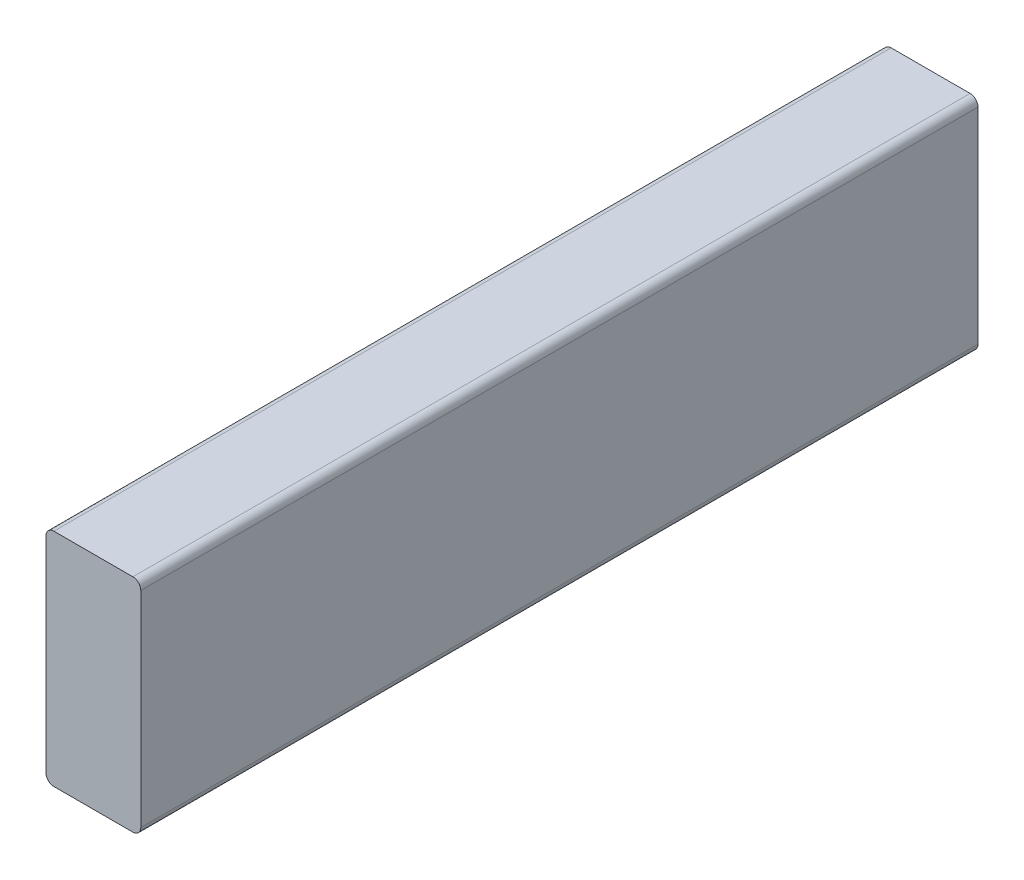
ISO-10303-21;
HEADER;
FILE_DESCRIPTION(('STEP AP214'),'2;1');
FILE_NAME('part.step','',(''),(''),'','','');
FILE_SCHEMA(('AUTOMOTIVE_DESIGN { 1 0 10303 214 1 1 1 1 }'));
ENDSEC;
DATA;
#1=APPLICATION_CONTEXT('core data for automotive mechanical design processes');
#2=APPLICATION_PROTOCOL_DEFINITION('international standard','automotive_design',2000,#1);
#3=PRODUCT_CONTEXT('',#1,'mechanical');
#4=PRODUCT('Part','Part','',(#3));
#5=PRODUCT_RELATED_PRODUCT_CATEGORY('part','',(#4));
#6=PRODUCT_DEFINITION_FORMATION('','',#4);
#7=PRODUCT_DEFINITION_CONTEXT('part definition',#1,'design');
#8=PRODUCT_DEFINITION('design','',#6,#7);
#9=PRODUCT_DEFINITION_SHAPE('','',#8);
#10=(LENGTH_UNIT() NAMED_UNIT(*) SI_UNIT(.MILLI.,.METRE.));
#11=(NAMED_UNIT(*) PLANE_ANGLE_UNIT() SI_UNIT($,.RADIAN.));
#12=(NAMED_UNIT(*) SI_UNIT($,.STERADIAN.) SOLID_ANGLE_UNIT());
#13=UNCERTAINTY_MEASURE_WITH_UNIT(LENGTH_MEASURE(1.E-05),#10,'distance_accuracy_value','');
#14=(GEOMETRIC_REPRESENTATION_CONTEXT(3) GLOBAL_UNCERTAINTY_ASSIGNED_CONTEXT((#13)) GLOBAL_UNIT_ASSIGNED_CONTEXT((#10,
#11,#12)) REPRESENTATION_CONTEXT('',''));
#15=CARTESIAN_POINT('',(0.,0.,0.));
#16=DIRECTION('',(0.,0.,1.));
#17=DIRECTION('',(1.,0.,0.));
#18=AXIS2_PLACEMENT_3D('',#15,#16,#17);
#19=CARTESIAN_POINT('',(19.05,44.45,-336.55));
#20=DIRECTION('',(1.,0.,0.));
#21=DIRECTION('',(0.,1.,0.));
#22=AXIS2_PLACEMENT_3D('',#19,#20,#21);
#23=PLANE('',#22);
#24=DIRECTION('',(0.,1.,0.));
#25=VECTOR('',#24,1.);
#26=CARTESIAN_POINT('',(19.05,44.45,0.));
#27=LINE('',#26,#25);
#28=CARTESIAN_POINT('',(19.05,-41.275,0.));
#29=VERTEX_POINT('',#28);
#30=CARTESIAN_POINT('',(19.05,41.275,0.));
#31=VERTEX_POINT('',#30);
#32=EDGE_CURVE('E103',#29,#31,#27,.T.);
#33=ORIENTED_EDGE('',*,*,#32,.F.);
#34=DIRECTION('',(0.,0.,1.));
#35=VECTOR('',#34,1.);
#36=CARTESIAN_POINT('',(19.05,-41.275,-336.55));
#37=LINE('',#36,#35);
#38=CARTESIAN_POINT('',(19.05,-41.275,-336.55));
#39=VERTEX_POINT('',#38);
#40=EDGE_CURVE('E11',#29,#39,#37,.F.);
#41=ORIENTED_EDGE('',*,*,#40,.T.);
#42=DIRECTION('',(0.,1.,0.));
#43=VECTOR('',#42,1.);
#44=CARTESIAN_POINT('',(19.05,44.45,-336.55));
#45=LINE('',#44,#43);
#46=CARTESIAN_POINT('',(19.05,41.275,-336.55));
#47=VERTEX_POINT('',#46);
#48=EDGE_CURVE('E153',#39,#47,#45,.T.);
#49=ORIENTED_EDGE('',*,*,#48,.T.);
#50=DIRECTION('',(0.,0.,1.));
#51=VECTOR('',#50,1.);
#52=CARTESIAN_POINT('',(19.05,41.275,-336.55));
#53=LINE('',#52,#51);
#54=EDGE_CURVE('E40',#47,#31,#53,.T.);
#55=ORIENTED_EDGE('',*,*,#54,.T.);
#56=EDGE_LOOP('',(#33,#41,#49,#55));
#57=FACE_BOUND('',#56,.T.);
#58=ADVANCED_FACE('F32',(#57),#23,.T.);
#59=CARTESIAN_POINT('',(-19.05,-44.45,-336.55));
#60=DIRECTION('',(0.,-1.,0.));
#61=DIRECTION('',(0.,0.,-1.));
#62=AXIS2_PLACEMENT_3D('',#59,#60,#61);
#63=PLANE('',#62);
#64=DIRECTION('',(1.,0.,0.));
#65=VECTOR('',#64,1.);
#66=CARTESIAN_POINT('',(-19.05,-44.45,0.));
#67=LINE('',#66,#65);
#68=CARTESIAN_POINT('',(-15.875,-44.45,0.));
#69=VERTEX_POINT('',#68);
#70=CARTESIAN_POINT('',(15.875,-44.45,0.));
#71=VERTEX_POINT('',#70);
#72=EDGE_CURVE('E128',#69,#71,#67,.T.);
#73=ORIENTED_EDGE('',*,*,#72,.F.);
#74=DIRECTION('',(0.,0.,1.));
#75=VECTOR('',#74,1.);
#76=CARTESIAN_POINT('',(-15.875,-44.45,-336.55));
#77=LINE('',#76,#75);
#78=CARTESIAN_POINT('',(-15.875,-44.45,-336.55));
#79=VERTEX_POINT('',#78);
#80=EDGE_CURVE('E54',#69,#79,#77,.F.);
#81=ORIENTED_EDGE('',*,*,#80,.T.);
#82=DIRECTION('',(1.,0.,0.));
#83=VECTOR('',#82,1.);
#84=CARTESIAN_POINT('',(-19.05,-44.45,-336.55));
#85=LINE('',#84,#83);
#86=CARTESIAN_POINT('',(15.875,-44.45,-336.55));
#87=VERTEX_POINT('',#86);
#88=EDGE_CURVE('E122',#79,#87,#85,.T.);
#89=ORIENTED_EDGE('',*,*,#88,.T.);
#90=DIRECTION('',(0.,0.,1.));
#91=VECTOR('',#90,1.);
#92=CARTESIAN_POINT('',(15.875,-44.45,-336.55));
#93=LINE('',#92,#91);
#94=EDGE_CURVE('E147',#87,#71,#93,.T.);
#95=ORIENTED_EDGE('',*,*,#94,.T.);
#96=EDGE_LOOP('',(#73,#81,#89,#95));
#97=FACE_BOUND('',#96,.T.);
#98=ADVANCED_FACE('F185',(#97),#63,.T.);
#99=CARTESIAN_POINT('',(-19.05,44.45,-336.55));
#100=DIRECTION('',(-1.,0.,0.));
#101=DIRECTION('',(0.,-1.,0.));
#102=AXIS2_PLACEMENT_3D('',#99,#100,#101);
#103=PLANE('',#102);
#104=DIRECTION('',(0.,-1.,0.));
#105=VECTOR('',#104,1.);
#106=CARTESIAN_POINT('',(-19.05,44.45,0.));
#107=LINE('',#106,#105);
#108=CARTESIAN_POINT('',(-19.05,41.275,0.));
#109=VERTEX_POINT('',#108);
#110=CARTESIAN_POINT('',(-19.05,-41.275,0.));
#111=VERTEX_POINT('',#110);
#112=EDGE_CURVE('E118',#109,#111,#107,.T.);
#113=ORIENTED_EDGE('',*,*,#112,.F.);
#114=DIRECTION('',(0.,0.,1.));
#115=VECTOR('',#114,1.);
#116=CARTESIAN_POINT('',(-19.05,41.275,-336.55));
#117=LINE('',#116,#115);
#118=CARTESIAN_POINT('',(-19.05,41.275,-336.55));
#119=VERTEX_POINT('',#118);
#120=EDGE_CURVE('E139',#109,#119,#117,.F.);
#121=ORIENTED_EDGE('',*,*,#120,.T.);
#122=DIRECTION('',(0.,-1.,0.));
#123=VECTOR('',#122,1.);
#124=CARTESIAN_POINT('',(-19.05,44.45,-336.55));
#125=LINE('',#124,#123);
#126=CARTESIAN_POINT('',(-19.05,-41.275,-336.55));
#127=VERTEX_POINT('',#126);
#128=EDGE_CURVE('E125',#119,#127,#125,.T.);
#129=ORIENTED_EDGE('',*,*,#128,.T.);
#130=DIRECTION('',(0.,0.,1.));
#131=VECTOR('',#130,1.);
#132=CARTESIAN_POINT('',(-19.05,-41.275,-336.55));
#133=LINE('',#132,#131);
#134=EDGE_CURVE('E136',#127,#111,#133,.T.);
#135=ORIENTED_EDGE('',*,*,#134,.T.);
#136=EDGE_LOOP('',(#113,#121,#129,#135));
#137=FACE_BOUND('',#136,.T.);
#138=ADVANCED_FACE('F165',(#137),#103,.T.);
#139=CARTESIAN_POINT('',(-19.05,44.45,-336.55));
#140=DIRECTION('',(0.,1.,0.));
#141=DIRECTION('',(0.,0.,1.));
#142=AXIS2_PLACEMENT_3D('',#139,#140,#141);
#143=PLANE('',#142);
#144=DIRECTION('',(-1.,0.,0.));
#145=VECTOR('',#144,1.);
#146=CARTESIAN_POINT('',(-19.05,44.45,-336.55));
#147=LINE('',#146,#145);
#148=CARTESIAN_POINT('',(15.875,44.45,-336.55));
#149=VERTEX_POINT('',#148);
#150=CARTESIAN_POINT('',(-15.875,44.45,-336.55));
#151=VERTEX_POINT('',#150);
#152=EDGE_CURVE('E154',#149,#151,#147,.T.);
#153=ORIENTED_EDGE('',*,*,#152,.T.);
#154=DIRECTION('',(0.,0.,1.));
#155=VECTOR('',#154,1.);
#156=CARTESIAN_POINT('',(-15.875,44.45,-336.55));
#157=LINE('',#156,#155);
#158=CARTESIAN_POINT('',(-15.875,44.45,0.));
#159=VERTEX_POINT('',#158);
#160=EDGE_CURVE('E109',#151,#159,#157,.T.);
#161=ORIENTED_EDGE('',*,*,#160,.T.);
#162=DIRECTION('',(-1.,0.,0.));
#163=VECTOR('',#162,1.);
#164=CARTESIAN_POINT('',(-19.05,44.45,0.));
#165=LINE('',#164,#163);
#166=CARTESIAN_POINT('',(15.875,44.45,0.));
#167=VERTEX_POINT('',#166);
#168=EDGE_CURVE('E101',#167,#159,#165,.T.);
#169=ORIENTED_EDGE('',*,*,#168,.F.);
#170=DIRECTION('',(0.,0.,1.));
#171=VECTOR('',#170,1.);
#172=CARTESIAN_POINT('',(15.875,44.45,-336.55));
#173=LINE('',#172,#171);
#174=EDGE_CURVE('E115',#167,#149,#173,.F.);
#175=ORIENTED_EDGE('',*,*,#174,.T.);
#176=EDGE_LOOP('',(#153,#161,#169,#175));
#177=FACE_BOUND('',#176,.T.);
#178=ADVANCED_FACE('F114',(#177),#143,.T.);
#179=CARTESIAN_POINT('',(0.,0.,-336.55));
#180=DIRECTION('',(0.,0.,1.));
#181=DIRECTION('',(1.,0.,0.));
#182=AXIS2_PLACEMENT_3D('',#179,#180,#181);
#183=PLANE('',#182);
#184=ORIENTED_EDGE('',*,*,#128,.F.);
#185=CARTESIAN_POINT('',(-15.875,41.275,-336.55));
#186=DIRECTION('',(0.,0.,1.));
#187=DIRECTION('',(1.,0.,0.));
#188=AXIS2_PLACEMENT_3D('',#185,#186,#187);
#189=CIRCLE('',#188,3.175);
#190=EDGE_CURVE('E145',#119,#151,#189,.F.);
#191=ORIENTED_EDGE('',*,*,#190,.T.);
#192=ORIENTED_EDGE('',*,*,#152,.F.);
#193=CARTESIAN_POINT('',(15.875,41.275,-336.55));
#194=DIRECTION('',(0.,0.,1.));
#195=DIRECTION('',(1.,0.,0.));
#196=AXIS2_PLACEMENT_3D('',#193,#194,#195);
#197=CIRCLE('',#196,3.175);
#198=EDGE_CURVE('E121',#149,#47,#197,.F.);
#199=ORIENTED_EDGE('',*,*,#198,.T.);
#200=ORIENTED_EDGE('',*,*,#48,.F.);
#201=CARTESIAN_POINT('',(15.875,-41.275,-336.55));
#202=DIRECTION('',(0.,0.,1.));
#203=DIRECTION('',(1.,0.,0.));
#204=AXIS2_PLACEMENT_3D('',#201,#202,#203);
#205=CIRCLE('',#204,3.175);
#206=EDGE_CURVE('E47',#39,#87,#205,.F.);
#207=ORIENTED_EDGE('',*,*,#206,.T.);
#208=ORIENTED_EDGE('',*,*,#88,.F.);
#209=CARTESIAN_POINT('',(-15.875,-41.275,-336.55));
#210=DIRECTION('',(0.,0.,1.));
#211=DIRECTION('',(1.,0.,0.));
#212=AXIS2_PLACEMENT_3D('',#209,#210,#211);
#213=CIRCLE('',#212,3.175);
#214=EDGE_CURVE('E143',#79,#127,#213,.F.);
#215=ORIENTED_EDGE('',*,*,#214,.T.);
#216=EDGE_LOOP('',(#184,#191,#192,#199,#200,#207,#208,#215));
#217=FACE_BOUND('',#216,.T.);
#218=ADVANCED_FACE('F171',(#217),#183,.F.);
#219=CARTESIAN_POINT('',(0.,0.,0.));
#220=DIRECTION('',(0.,0.,1.));
#221=DIRECTION('',(1.,0.,0.));
#222=AXIS2_PLACEMENT_3D('',#219,#220,#221);
#223=PLANE('',#222);
#224=ORIENTED_EDGE('',*,*,#168,.T.);
#225=CARTESIAN_POINT('',(-15.875,41.275,0.));
#226=DIRECTION('',(0.,0.,1.));
#227=DIRECTION('',(1.,0.,0.));
#228=AXIS2_PLACEMENT_3D('',#225,#226,#227);
#229=CIRCLE('',#228,3.175);
#230=EDGE_CURVE('E134',#159,#109,#229,.T.);
#231=ORIENTED_EDGE('',*,*,#230,.T.);
#232=ORIENTED_EDGE('',*,*,#112,.T.);
#233=CARTESIAN_POINT('',(-15.875,-41.275,0.));
#234=DIRECTION('',(0.,0.,1.));
#235=DIRECTION('',(1.,0.,0.));
#236=AXIS2_PLACEMENT_3D('',#233,#234,#235);
#237=CIRCLE('',#236,3.175);
#238=EDGE_CURVE('E132',#111,#69,#237,.T.);
#239=ORIENTED_EDGE('',*,*,#238,.T.);
#240=ORIENTED_EDGE('',*,*,#72,.T.);
#241=CARTESIAN_POINT('',(15.875,-41.275,0.));
#242=DIRECTION('',(0.,0.,1.));
#243=DIRECTION('',(1.,0.,0.));
#244=AXIS2_PLACEMENT_3D('',#241,#242,#243);
#245=CIRCLE('',#244,3.175);
#246=EDGE_CURVE('E108',#71,#29,#245,.T.);
#247=ORIENTED_EDGE('',*,*,#246,.T.);
#248=ORIENTED_EDGE('',*,*,#32,.T.);
#249=CARTESIAN_POINT('',(15.875,41.275,0.));
#250=DIRECTION('',(0.,0.,1.));
#251=DIRECTION('',(1.,0.,0.));
#252=AXIS2_PLACEMENT_3D('',#249,#250,#251);
#253=CIRCLE('',#252,3.175);
#254=EDGE_CURVE('E98',#31,#167,#253,.T.);
#255=ORIENTED_EDGE('',*,*,#254,.T.);
#256=EDGE_LOOP('',(#224,#231,#232,#239,#240,#247,#248,#255));
#257=FACE_BOUND('',#256,.T.);
#258=ADVANCED_FACE('F100',(#257),#223,.T.);
#259=CARTESIAN_POINT('',(-15.875,41.275,-336.55));
#260=DIRECTION('',(0.,0.,1.));
#261=DIRECTION('',(1.,0.,0.));
#262=AXIS2_PLACEMENT_3D('',#259,#260,#261);
#263=CYLINDRICAL_SURFACE('',#262,3.175);
#264=ORIENTED_EDGE('',*,*,#190,.F.);
#265=ORIENTED_EDGE('',*,*,#120,.F.);
#266=ORIENTED_EDGE('',*,*,#230,.F.);
#267=ORIENTED_EDGE('',*,*,#160,.F.);
#268=EDGE_LOOP('',(#264,#265,#266,#267));
#269=FACE_BOUND('',#268,.T.);
#270=ADVANCED_FACE('F170',(#269),#263,.T.);
#271=CARTESIAN_POINT('',(-15.875,-41.275,-336.55));
#272=DIRECTION('',(0.,0.,1.));
#273=DIRECTION('',(1.,0.,0.));
#274=AXIS2_PLACEMENT_3D('',#271,#272,#273);
#275=CYLINDRICAL_SURFACE('',#274,3.175);
#276=ORIENTED_EDGE('',*,*,#214,.F.);
#277=ORIENTED_EDGE('',*,*,#80,.F.);
#278=ORIENTED_EDGE('',*,*,#238,.F.);
#279=ORIENTED_EDGE('',*,*,#134,.F.);
#280=EDGE_LOOP('',(#276,#277,#278,#279));
#281=FACE_BOUND('',#280,.T.);
#282=ADVANCED_FACE('F174',(#281),#275,.T.);
#283=CARTESIAN_POINT('',(15.875,-41.275,-336.55));
#284=DIRECTION('',(0.,0.,1.));
#285=DIRECTION('',(1.,0.,0.));
#286=AXIS2_PLACEMENT_3D('',#283,#284,#285);
#287=CYLINDRICAL_SURFACE('',#286,3.175);
#288=ORIENTED_EDGE('',*,*,#206,.F.);
#289=ORIENTED_EDGE('',*,*,#40,.F.);
#290=ORIENTED_EDGE('',*,*,#246,.F.);
#291=ORIENTED_EDGE('',*,*,#94,.F.);
#292=EDGE_LOOP('',(#288,#289,#290,#291));
#293=FACE_BOUND('',#292,.T.);
#294=ADVANCED_FACE('F176',(#293),#287,.T.);
#295=CARTESIAN_POINT('',(15.875,41.275,-336.55));
#296=DIRECTION('',(0.,0.,1.));
#297=DIRECTION('',(1.,0.,0.));
#298=AXIS2_PLACEMENT_3D('',#295,#296,#297);
#299=CYLINDRICAL_SURFACE('',#298,3.175);
#300=ORIENTED_EDGE('',*,*,#198,.F.);
#301=ORIENTED_EDGE('',*,*,#174,.F.);
#302=ORIENTED_EDGE('',*,*,#254,.F.);
#303=ORIENTED_EDGE('',*,*,#54,.F.);
#304=EDGE_LOOP('',(#300,#301,#302,#303));
#305=FACE_BOUND('',#304,.T.);
#306=ADVANCED_FACE('F34',(#305),#299,.T.);
#307=CLOSED_SHELL('',(#58,#98,#138,#178,#218,#258,#270,#282,#294,#306));
#308=MANIFOLD_SOLID_BREP('B2',#307);
#309=ADVANCED_BREP_SHAPE_REPRESENTATION('',(#18,#308),#14);
#310=SHAPE_DEFINITION_REPRESENTATION(#9,#309);
ENDSEC;
END-ISO-10303-21;
